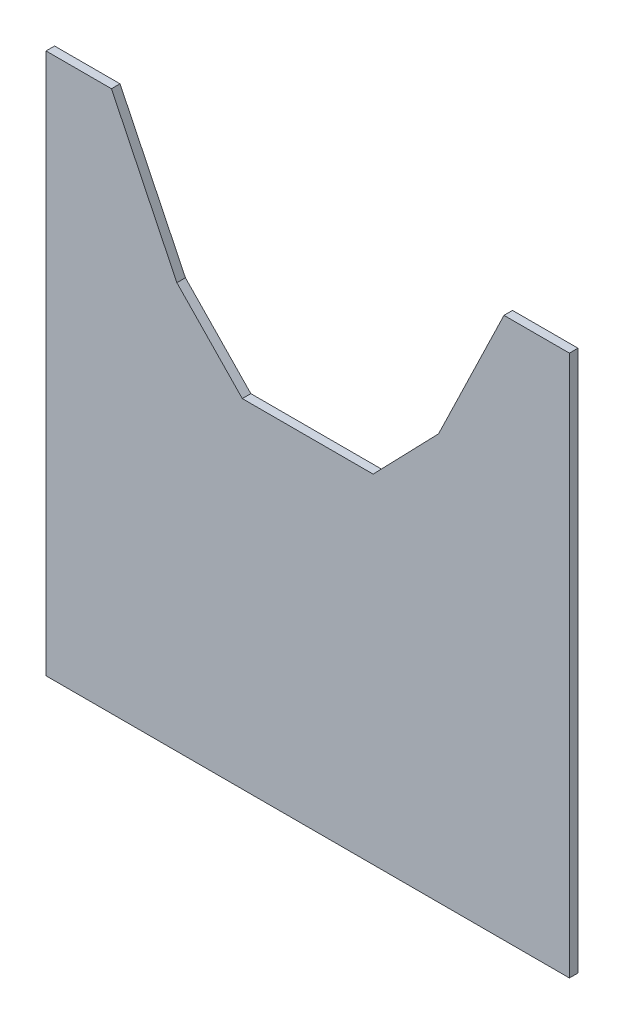
ISO-10303-21;
HEADER;
FILE_DESCRIPTION(('STEP AP214'),'2;1');
FILE_NAME('part.step','',(''),(''),'','','');
FILE_SCHEMA(('AUTOMOTIVE_DESIGN { 1 0 10303 214 1 1 1 1 }'));
ENDSEC;
DATA;
#1=APPLICATION_CONTEXT('core data for automotive mechanical design processes');
#2=APPLICATION_PROTOCOL_DEFINITION('international standard','automotive_design',2000,#1);
#3=PRODUCT_CONTEXT('',#1,'mechanical');
#4=PRODUCT('Part','Part','',(#3));
#5=PRODUCT_RELATED_PRODUCT_CATEGORY('part','',(#4));
#6=PRODUCT_DEFINITION_FORMATION('','',#4);
#7=PRODUCT_DEFINITION_CONTEXT('part definition',#1,'design');
#8=PRODUCT_DEFINITION('design','',#6,#7);
#9=PRODUCT_DEFINITION_SHAPE('','',#8);
#10=(LENGTH_UNIT() NAMED_UNIT(*) SI_UNIT(.MILLI.,.METRE.));
#11=(NAMED_UNIT(*) PLANE_ANGLE_UNIT() SI_UNIT($,.RADIAN.));
#12=(NAMED_UNIT(*) SI_UNIT($,.STERADIAN.) SOLID_ANGLE_UNIT());
#13=UNCERTAINTY_MEASURE_WITH_UNIT(LENGTH_MEASURE(1.E-05),#10,'distance_accuracy_value','');
#14=(GEOMETRIC_REPRESENTATION_CONTEXT(3) GLOBAL_UNCERTAINTY_ASSIGNED_CONTEXT((#13)) GLOBAL_UNIT_ASSIGNED_CONTEXT((#10,
#11,#12)) REPRESENTATION_CONTEXT('',''));
#15=CARTESIAN_POINT('',(0.,0.,0.));
#16=DIRECTION('',(0.,0.,1.));
#17=DIRECTION('',(1.,0.,0.));
#18=AXIS2_PLACEMENT_3D('',#15,#16,#17);
#19=CARTESIAN_POINT('',(-97.155,100.457,3.175));
#20=DIRECTION('',(1.,0.,0.));
#21=DIRECTION('',(0.,1.,0.));
#22=AXIS2_PLACEMENT_3D('',#19,#20,#21);
#23=PLANE('',#22);
#24=DIRECTION('',(0.,-1.,0.));
#25=VECTOR('',#24,1.);
#26=CARTESIAN_POINT('',(-97.155,100.457,0.));
#27=LINE('',#26,#25);
#28=CARTESIAN_POINT('',(-97.155,100.457,0.));
#29=VERTEX_POINT('',#28);
#30=CARTESIAN_POINT('',(-97.155,-100.457,0.));
#31=VERTEX_POINT('',#30);
#32=EDGE_CURVE('E152',#29,#31,#27,.T.);
#33=ORIENTED_EDGE('',*,*,#32,.T.);
#34=DIRECTION('',(0.,0.,-1.));
#35=VECTOR('',#34,1.);
#36=CARTESIAN_POINT('',(-97.155,-100.457,3.175));
#37=LINE('',#36,#35);
#38=CARTESIAN_POINT('',(-97.155,-100.457,3.175));
#39=VERTEX_POINT('',#38);
#40=EDGE_CURVE('E11',#39,#31,#37,.T.);
#41=ORIENTED_EDGE('',*,*,#40,.F.);
#42=DIRECTION('',(0.,-1.,0.));
#43=VECTOR('',#42,1.);
#44=CARTESIAN_POINT('',(-97.155,100.457,3.175));
#45=LINE('',#44,#43);
#46=CARTESIAN_POINT('',(-97.155,100.457,3.175));
#47=VERTEX_POINT('',#46);
#48=EDGE_CURVE('E187',#47,#39,#45,.T.);
#49=ORIENTED_EDGE('',*,*,#48,.F.);
#50=DIRECTION('',(0.,0.,-1.));
#51=VECTOR('',#50,1.);
#52=CARTESIAN_POINT('',(-97.155,100.457,3.175));
#53=LINE('',#52,#51);
#54=EDGE_CURVE('E56',#47,#29,#53,.T.);
#55=ORIENTED_EDGE('',*,*,#54,.T.);
#56=EDGE_LOOP('',(#33,#41,#49,#55));
#57=FACE_BOUND('',#56,.T.);
#58=ADVANCED_FACE('F39',(#57),#23,.F.);
#59=CARTESIAN_POINT('',(-97.155,-100.457,3.175));
#60=DIRECTION('',(0.,1.,0.));
#61=DIRECTION('',(0.,0.,1.));
#62=AXIS2_PLACEMENT_3D('',#59,#60,#61);
#63=PLANE('',#62);
#64=DIRECTION('',(1.,0.,0.));
#65=VECTOR('',#64,1.);
#66=CARTESIAN_POINT('',(-97.155,-100.457,0.));
#67=LINE('',#66,#65);
#68=CARTESIAN_POINT('',(97.155,-100.457,0.));
#69=VERTEX_POINT('',#68);
#70=EDGE_CURVE('E155',#31,#69,#67,.T.);
#71=ORIENTED_EDGE('',*,*,#70,.T.);
#72=DIRECTION('',(0.,0.,-1.));
#73=VECTOR('',#72,1.);
#74=CARTESIAN_POINT('',(97.155,-100.457,3.175));
#75=LINE('',#74,#73);
#76=CARTESIAN_POINT('',(97.155,-100.457,3.175));
#77=VERTEX_POINT('',#76);
#78=EDGE_CURVE('E48',#77,#69,#75,.T.);
#79=ORIENTED_EDGE('',*,*,#78,.F.);
#80=DIRECTION('',(1.,0.,0.));
#81=VECTOR('',#80,1.);
#82=CARTESIAN_POINT('',(-97.155,-100.457,3.175));
#83=LINE('',#82,#81);
#84=EDGE_CURVE('E100',#39,#77,#83,.T.);
#85=ORIENTED_EDGE('',*,*,#84,.F.);
#86=ORIENTED_EDGE('',*,*,#40,.T.);
#87=EDGE_LOOP('',(#71,#79,#85,#86));
#88=FACE_BOUND('',#87,.T.);
#89=ADVANCED_FACE('F213',(#88),#63,.F.);
#90=CARTESIAN_POINT('',(97.155,100.457,3.175));
#91=DIRECTION('',(1.,0.,0.));
#92=DIRECTION('',(0.,1.,0.));
#93=AXIS2_PLACEMENT_3D('',#90,#91,#92);
#94=PLANE('',#93);
#95=DIRECTION('',(0.,-1.,0.));
#96=VECTOR('',#95,1.);
#97=CARTESIAN_POINT('',(97.155,100.457,0.));
#98=LINE('',#97,#96);
#99=CARTESIAN_POINT('',(97.155,100.457,0.));
#100=VERTEX_POINT('',#99);
#101=EDGE_CURVE('E159',#100,#69,#98,.T.);
#102=ORIENTED_EDGE('',*,*,#101,.F.);
#103=DIRECTION('',(0.,0.,-1.));
#104=VECTOR('',#103,1.);
#105=CARTESIAN_POINT('',(97.155,100.457,3.175));
#106=LINE('',#105,#104);
#107=CARTESIAN_POINT('',(97.155,100.457,3.175));
#108=VERTEX_POINT('',#107);
#109=EDGE_CURVE('E204',#108,#100,#106,.T.);
#110=ORIENTED_EDGE('',*,*,#109,.F.);
#111=DIRECTION('',(0.,-1.,0.));
#112=VECTOR('',#111,1.);
#113=CARTESIAN_POINT('',(97.155,100.457,3.175));
#114=LINE('',#113,#112);
#115=EDGE_CURVE('E212',#108,#77,#114,.T.);
#116=ORIENTED_EDGE('',*,*,#115,.T.);
#117=ORIENTED_EDGE('',*,*,#78,.T.);
#118=EDGE_LOOP('',(#102,#110,#116,#117));
#119=FACE_BOUND('',#118,.T.);
#120=ADVANCED_FACE('F210',(#119),#94,.T.);
#121=CARTESIAN_POINT('',(72.86625,100.457,3.175));
#122=DIRECTION('',(0.,1.,0.));
#123=DIRECTION('',(0.,0.,1.));
#124=AXIS2_PLACEMENT_3D('',#121,#122,#123);
#125=PLANE('',#124);
#126=DIRECTION('',(1.,0.,0.));
#127=VECTOR('',#126,1.);
#128=CARTESIAN_POINT('',(72.86625,100.457,0.));
#129=LINE('',#128,#127);
#130=CARTESIAN_POINT('',(72.86625,100.457,0.));
#131=VERTEX_POINT('',#130);
#132=EDGE_CURVE('E163',#131,#100,#129,.T.);
#133=ORIENTED_EDGE('',*,*,#132,.F.);
#134=DIRECTION('',(0.,0.,-1.));
#135=VECTOR('',#134,1.);
#136=CARTESIAN_POINT('',(72.86625,100.457,3.175));
#137=LINE('',#136,#135);
#138=CARTESIAN_POINT('',(72.86625,100.457,3.175));
#139=VERTEX_POINT('',#138);
#140=EDGE_CURVE('E201',#139,#131,#137,.T.);
#141=ORIENTED_EDGE('',*,*,#140,.F.);
#142=DIRECTION('',(1.,0.,0.));
#143=VECTOR('',#142,1.);
#144=CARTESIAN_POINT('',(72.86625,100.457,3.175));
#145=LINE('',#144,#143);
#146=EDGE_CURVE('E225',#139,#108,#145,.T.);
#147=ORIENTED_EDGE('',*,*,#146,.T.);
#148=ORIENTED_EDGE('',*,*,#109,.T.);
#149=EDGE_LOOP('',(#133,#141,#147,#148));
#150=FACE_BOUND('',#149,.T.);
#151=ADVANCED_FACE('F221',(#150),#125,.T.);
#152=CARTESIAN_POINT('',(72.86625,100.457,3.175));
#153=DIRECTION('',(0.900267183737692,-0.435337797445851,0.));
#154=DIRECTION('',(0.435337797445851,0.900267183737692,0.));
#155=AXIS2_PLACEMENT_3D('',#152,#153,#154);
#156=PLANE('',#155);
#157=DIRECTION('',(-0.435337797445851,-0.900267183737692,0.));
#158=VECTOR('',#157,1.);
#159=CARTESIAN_POINT('',(72.86625,100.457,0.));
#160=LINE('',#159,#158);
#161=CARTESIAN_POINT('',(48.5775,50.2285,0.));
#162=VERTEX_POINT('',#161);
#163=EDGE_CURVE('E167',#131,#162,#160,.T.);
#164=ORIENTED_EDGE('',*,*,#163,.T.);
#165=DIRECTION('',(0.,0.,-1.));
#166=VECTOR('',#165,1.);
#167=CARTESIAN_POINT('',(48.5775,50.2285,3.175));
#168=LINE('',#167,#166);
#169=CARTESIAN_POINT('',(48.5775,50.2285,3.175));
#170=VERTEX_POINT('',#169);
#171=EDGE_CURVE('E197',#170,#162,#168,.T.);
#172=ORIENTED_EDGE('',*,*,#171,.F.);
#173=DIRECTION('',(-0.435337797445851,-0.900267183737692,0.));
#174=VECTOR('',#173,1.);
#175=CARTESIAN_POINT('',(72.86625,100.457,3.175));
#176=LINE('',#175,#174);
#177=EDGE_CURVE('E230',#139,#170,#176,.T.);
#178=ORIENTED_EDGE('',*,*,#177,.F.);
#179=ORIENTED_EDGE('',*,*,#140,.T.);
#180=EDGE_LOOP('',(#164,#172,#178,#179));
#181=FACE_BOUND('',#180,.T.);
#182=ADVANCED_FACE('F266',(#181),#156,.F.);
#183=CARTESIAN_POINT('',(48.5775,50.2285,3.175));
#184=DIRECTION('',(0.718821846805456,-0.695194327188588,0.));
#185=DIRECTION('',(0.695194327188588,0.718821846805456,0.));
#186=AXIS2_PLACEMENT_3D('',#183,#184,#185);
#187=PLANE('',#186);
#188=DIRECTION('',(-0.695194327188588,-0.718821846805456,0.));
#189=VECTOR('',#188,1.);
#190=CARTESIAN_POINT('',(48.5775,50.2285,0.));
#191=LINE('',#190,#189);
#192=CARTESIAN_POINT('',(24.28875,25.11425,0.));
#193=VERTEX_POINT('',#192);
#194=EDGE_CURVE('E170',#162,#193,#191,.T.);
#195=ORIENTED_EDGE('',*,*,#194,.T.);
#196=DIRECTION('',(0.,0.,-1.));
#197=VECTOR('',#196,1.);
#198=CARTESIAN_POINT('',(24.28875,25.11425,3.175));
#199=LINE('',#198,#197);
#200=CARTESIAN_POINT('',(24.28875,25.11425,3.175));
#201=VERTEX_POINT('',#200);
#202=EDGE_CURVE('E194',#201,#193,#199,.T.);
#203=ORIENTED_EDGE('',*,*,#202,.F.);
#204=DIRECTION('',(-0.695194327188588,-0.718821846805456,0.));
#205=VECTOR('',#204,1.);
#206=CARTESIAN_POINT('',(48.5775,50.2285,3.175));
#207=LINE('',#206,#205);
#208=EDGE_CURVE('E237',#170,#201,#207,.T.);
#209=ORIENTED_EDGE('',*,*,#208,.F.);
#210=ORIENTED_EDGE('',*,*,#171,.T.);
#211=EDGE_LOOP('',(#195,#203,#209,#210));
#212=FACE_BOUND('',#211,.T.);
#213=ADVANCED_FACE('F269',(#212),#187,.F.);
#214=CARTESIAN_POINT('',(-24.28875,25.11425,3.175));
#215=DIRECTION('',(0.,1.,0.));
#216=DIRECTION('',(0.,0.,1.));
#217=AXIS2_PLACEMENT_3D('',#214,#215,#216);
#218=PLANE('',#217);
#219=DIRECTION('',(1.,0.,0.));
#220=VECTOR('',#219,1.);
#221=CARTESIAN_POINT('',(-24.28875,25.11425,0.));
#222=LINE('',#221,#220);
#223=CARTESIAN_POINT('',(-24.28875,25.11425,0.));
#224=VERTEX_POINT('',#223);
#225=EDGE_CURVE('E174',#224,#193,#222,.T.);
#226=ORIENTED_EDGE('',*,*,#225,.F.);
#227=DIRECTION('',(0.,0.,-1.));
#228=VECTOR('',#227,1.);
#229=CARTESIAN_POINT('',(-24.28875,25.11425,3.175));
#230=LINE('',#229,#228);
#231=CARTESIAN_POINT('',(-24.28875,25.11425,3.175));
#232=VERTEX_POINT('',#231);
#233=EDGE_CURVE('E132',#232,#224,#230,.T.);
#234=ORIENTED_EDGE('',*,*,#233,.F.);
#235=DIRECTION('',(1.,0.,0.));
#236=VECTOR('',#235,1.);
#237=CARTESIAN_POINT('',(-24.28875,25.11425,3.175));
#238=LINE('',#237,#236);
#239=EDGE_CURVE('E141',#232,#201,#238,.T.);
#240=ORIENTED_EDGE('',*,*,#239,.T.);
#241=ORIENTED_EDGE('',*,*,#202,.T.);
#242=EDGE_LOOP('',(#226,#234,#240,#241));
#243=FACE_BOUND('',#242,.T.);
#244=ADVANCED_FACE('F242',(#243),#218,.T.);
#245=CARTESIAN_POINT('',(-48.5775,50.2285,3.175));
#246=DIRECTION('',(0.718821846805456,0.695194327188588,0.));
#247=DIRECTION('',(-0.695194327188588,0.718821846805456,0.));
#248=AXIS2_PLACEMENT_3D('',#245,#246,#247);
#249=PLANE('',#248);
#250=DIRECTION('',(0.695194327188588,-0.718821846805456,0.));
#251=VECTOR('',#250,1.);
#252=CARTESIAN_POINT('',(-48.5775,50.2285,0.));
#253=LINE('',#252,#251);
#254=CARTESIAN_POINT('',(-48.5775,50.2285,0.));
#255=VERTEX_POINT('',#254);
#256=EDGE_CURVE('E127',#255,#224,#253,.T.);
#257=ORIENTED_EDGE('',*,*,#256,.F.);
#258=DIRECTION('',(0.,0.,-1.));
#259=VECTOR('',#258,1.);
#260=CARTESIAN_POINT('',(-48.5775,50.2285,3.175));
#261=LINE('',#260,#259);
#262=CARTESIAN_POINT('',(-48.5775,50.2285,3.175));
#263=VERTEX_POINT('',#262);
#264=EDGE_CURVE('E122',#263,#255,#261,.T.);
#265=ORIENTED_EDGE('',*,*,#264,.F.);
#266=DIRECTION('',(0.695194327188588,-0.718821846805456,0.));
#267=VECTOR('',#266,1.);
#268=CARTESIAN_POINT('',(-48.5775,50.2285,3.175));
#269=LINE('',#268,#267);
#270=EDGE_CURVE('E125',#263,#232,#269,.T.);
#271=ORIENTED_EDGE('',*,*,#270,.T.);
#272=ORIENTED_EDGE('',*,*,#233,.T.);
#273=EDGE_LOOP('',(#257,#265,#271,#272));
#274=FACE_BOUND('',#273,.T.);
#275=ADVANCED_FACE('F124',(#274),#249,.T.);
#276=CARTESIAN_POINT('',(-72.86625,100.457,3.175));
#277=DIRECTION('',(0.900267183737692,0.435337797445851,0.));
#278=DIRECTION('',(-0.435337797445851,0.900267183737692,0.));
#279=AXIS2_PLACEMENT_3D('',#276,#277,#278);
#280=PLANE('',#279);
#281=DIRECTION('',(0.435337797445851,-0.900267183737692,0.));
#282=VECTOR('',#281,1.);
#283=CARTESIAN_POINT('',(-72.86625,100.457,0.));
#284=LINE('',#283,#282);
#285=CARTESIAN_POINT('',(-72.86625,100.457,0.));
#286=VERTEX_POINT('',#285);
#287=EDGE_CURVE('E180',#286,#255,#284,.T.);
#288=ORIENTED_EDGE('',*,*,#287,.F.);
#289=DIRECTION('',(0.,0.,-1.));
#290=VECTOR('',#289,1.);
#291=CARTESIAN_POINT('',(-72.86625,100.457,3.175));
#292=LINE('',#291,#290);
#293=CARTESIAN_POINT('',(-72.86625,100.457,3.175));
#294=VERTEX_POINT('',#293);
#295=EDGE_CURVE('E88',#294,#286,#292,.T.);
#296=ORIENTED_EDGE('',*,*,#295,.F.);
#297=DIRECTION('',(0.435337797445851,-0.900267183737692,0.));
#298=VECTOR('',#297,1.);
#299=CARTESIAN_POINT('',(-72.86625,100.457,3.175));
#300=LINE('',#299,#298);
#301=EDGE_CURVE('E139',#294,#263,#300,.T.);
#302=ORIENTED_EDGE('',*,*,#301,.T.);
#303=ORIENTED_EDGE('',*,*,#264,.T.);
#304=EDGE_LOOP('',(#288,#296,#302,#303));
#305=FACE_BOUND('',#304,.T.);
#306=ADVANCED_FACE('F144',(#305),#280,.T.);
#307=CARTESIAN_POINT('',(-97.155,100.457,3.175));
#308=DIRECTION('',(0.,1.,0.));
#309=DIRECTION('',(0.,0.,1.));
#310=AXIS2_PLACEMENT_3D('',#307,#308,#309);
#311=PLANE('',#310);
#312=DIRECTION('',(1.,0.,0.));
#313=VECTOR('',#312,1.);
#314=CARTESIAN_POINT('',(-97.155,100.457,0.));
#315=LINE('',#314,#313);
#316=EDGE_CURVE('E183',#29,#286,#315,.T.);
#317=ORIENTED_EDGE('',*,*,#316,.F.);
#318=ORIENTED_EDGE('',*,*,#54,.F.);
#319=DIRECTION('',(1.,0.,0.));
#320=VECTOR('',#319,1.);
#321=CARTESIAN_POINT('',(-97.155,100.457,3.175));
#322=LINE('',#321,#320);
#323=EDGE_CURVE('E146',#47,#294,#322,.T.);
#324=ORIENTED_EDGE('',*,*,#323,.T.);
#325=ORIENTED_EDGE('',*,*,#295,.T.);
#326=EDGE_LOOP('',(#317,#318,#324,#325));
#327=FACE_BOUND('',#326,.T.);
#328=ADVANCED_FACE('F244',(#327),#311,.T.);
#329=CARTESIAN_POINT('',(0.,0.,3.175));
#330=DIRECTION('',(0.,0.,1.));
#331=DIRECTION('',(1.,0.,0.));
#332=AXIS2_PLACEMENT_3D('',#329,#330,#331);
#333=PLANE('',#332);
#334=ORIENTED_EDGE('',*,*,#48,.T.);
#335=ORIENTED_EDGE('',*,*,#84,.T.);
#336=ORIENTED_EDGE('',*,*,#115,.F.);
#337=ORIENTED_EDGE('',*,*,#146,.F.);
#338=ORIENTED_EDGE('',*,*,#177,.T.);
#339=ORIENTED_EDGE('',*,*,#208,.T.);
#340=ORIENTED_EDGE('',*,*,#239,.F.);
#341=ORIENTED_EDGE('',*,*,#270,.F.);
#342=ORIENTED_EDGE('',*,*,#301,.F.);
#343=ORIENTED_EDGE('',*,*,#323,.F.);
#344=EDGE_LOOP('',(#334,#335,#336,#337,#338,#339,#340,#341,#342,#343));
#345=FACE_BOUND('',#344,.T.);
#346=ADVANCED_FACE('F137',(#345),#333,.T.);
#347=CARTESIAN_POINT('',(0.,0.,0.));
#348=DIRECTION('',(0.,0.,1.));
#349=DIRECTION('',(1.,0.,0.));
#350=AXIS2_PLACEMENT_3D('',#347,#348,#349);
#351=PLANE('',#350);
#352=ORIENTED_EDGE('',*,*,#32,.F.);
#353=ORIENTED_EDGE('',*,*,#316,.T.);
#354=ORIENTED_EDGE('',*,*,#287,.T.);
#355=ORIENTED_EDGE('',*,*,#256,.T.);
#356=ORIENTED_EDGE('',*,*,#225,.T.);
#357=ORIENTED_EDGE('',*,*,#194,.F.);
#358=ORIENTED_EDGE('',*,*,#163,.F.);
#359=ORIENTED_EDGE('',*,*,#132,.T.);
#360=ORIENTED_EDGE('',*,*,#101,.T.);
#361=ORIENTED_EDGE('',*,*,#70,.F.);
#362=EDGE_LOOP('',(#352,#353,#354,#355,#356,#357,#358,#359,#360,#361));
#363=FACE_BOUND('',#362,.T.);
#364=ADVANCED_FACE('F216',(#363),#351,.F.);
#365=CLOSED_SHELL('',(#58,#89,#120,#151,#182,#213,#244,#275,#306,#328,#346,#364));
#366=MANIFOLD_SOLID_BREP('B2',#365);
#367=ADVANCED_BREP_SHAPE_REPRESENTATION('',(#18,#366),#14);
#368=SHAPE_DEFINITION_REPRESENTATION(#9,#367);
ENDSEC;
END-ISO-10303-21;
